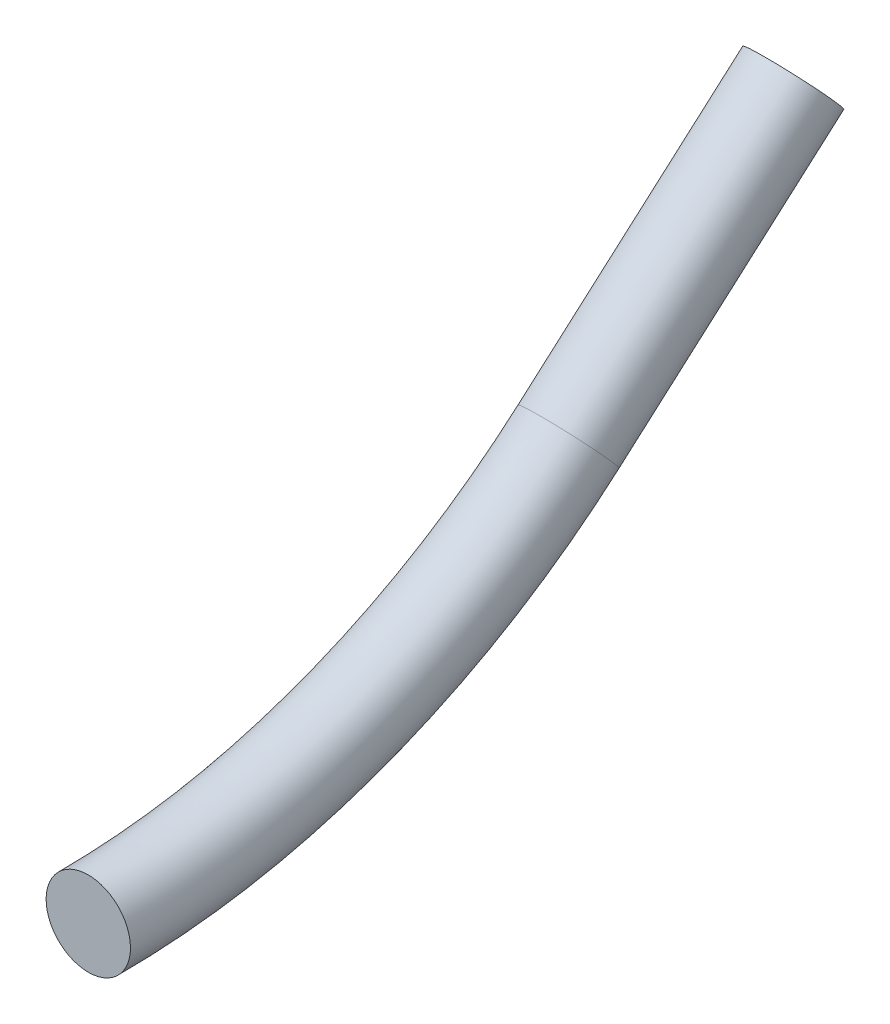
ISO-10303-21;
HEADER;
FILE_DESCRIPTION(('STEP AP214'),'2;1');
FILE_NAME('part.step','',(''),(''),'','','');
FILE_SCHEMA(('AUTOMOTIVE_DESIGN { 1 0 10303 214 1 1 1 1 }'));
ENDSEC;
DATA;
#1=APPLICATION_CONTEXT('core data for automotive mechanical design processes');
#2=APPLICATION_PROTOCOL_DEFINITION('international standard','automotive_design',2000,#1);
#3=PRODUCT_CONTEXT('',#1,'mechanical');
#4=PRODUCT('Part','Part','',(#3));
#5=PRODUCT_RELATED_PRODUCT_CATEGORY('part','',(#4));
#6=PRODUCT_DEFINITION_FORMATION('','',#4);
#7=PRODUCT_DEFINITION_CONTEXT('part definition',#1,'design');
#8=PRODUCT_DEFINITION('design','',#6,#7);
#9=PRODUCT_DEFINITION_SHAPE('','',#8);
#10=(LENGTH_UNIT() NAMED_UNIT(*) SI_UNIT(.MILLI.,.METRE.));
#11=(NAMED_UNIT(*) PLANE_ANGLE_UNIT() SI_UNIT($,.RADIAN.));
#12=(NAMED_UNIT(*) SI_UNIT($,.STERADIAN.) SOLID_ANGLE_UNIT());
#13=UNCERTAINTY_MEASURE_WITH_UNIT(LENGTH_MEASURE(1.E-05),#10,'distance_accuracy_value','');
#14=(GEOMETRIC_REPRESENTATION_CONTEXT(3) GLOBAL_UNCERTAINTY_ASSIGNED_CONTEXT((#13)) GLOBAL_UNIT_ASSIGNED_CONTEXT((#10,
#11,#12)) REPRESENTATION_CONTEXT('',''));
#15=CARTESIAN_POINT('',(0.,0.,0.));
#16=DIRECTION('',(0.,0.,1.));
#17=DIRECTION('',(1.,0.,0.));
#18=AXIS2_PLACEMENT_3D('',#15,#16,#17);
#19=CARTESIAN_POINT('',(0.,438.786528354059,1732.00940009833));
#20=DIRECTION('',(-1.,0.,0.));
#21=DIRECTION('',(0.,0.,1.));
#22=AXIS2_PLACEMENT_3D('',#19,#20,#21);
#23=TOROIDAL_SURFACE('',#22,1475.1544496116,85.725);
#24=CARTESIAN_POINT('',(-8.88178419700125E-13,-667.145720816301,755.795022794911));
#25=DIRECTION('',(0.,-0.661770960702079,0.749706072785493));
#26=DIRECTION('',(0.,-0.749706072785493,-0.661770960702079));
#27=AXIS2_PLACEMENT_3D('',#24,#25,#26);
#28=CIRCLE('',#27,85.725);
#29=CARTESIAN_POINT('',(-9.39792740525201E-13,-731.414273905836,699.064707188726));
#30=VERTEX_POINT('',#29);
#31=EDGE_CURVE('E39',#30,#30,#28,.T.);
#32=CARTESIAN_POINT('',(-8.88178419700125E-13,-1036.36792125755,1732.00940009832));
#33=DIRECTION('',(0.,0.,1.));
#34=DIRECTION('',(0.,-1.,0.));
#35=AXIS2_PLACEMENT_3D('',#32,#33,#34);
#36=CIRCLE('',#35,85.725);
#37=CARTESIAN_POINT('',(-9.39792740525199E-13,-1122.09292125754,1732.00940009832));
#38=VERTEX_POINT('',#37);
#39=EDGE_CURVE('E10',#38,#38,#36,.T.);
#40=CARTESIAN_POINT('',(0.,438.786528354059,1732.00940009833));
#41=DIRECTION('',(-1.,0.,0.));
#42=DIRECTION('',(0.,0.,1.));
#43=AXIS2_PLACEMENT_3D('',#40,#41,#42);
#44=CIRCLE('',#43,1560.8794496116);
#45=EDGE_CURVE('',#30,#38,#44,.T.);
#46=ORIENTED_EDGE('',*,*,#31,.T.);
#47=ORIENTED_EDGE('',*,*,#39,.F.);
#48=ORIENTED_EDGE('',*,*,#45,.T.);
#49=ORIENTED_EDGE('',*,*,#45,.F.);
#50=EDGE_LOOP('',(#46,#48,#47,#49));
#51=FACE_BOUND('',#50,.T.);
#52=ADVANCED_FACE('F33',(#51),#23,.T.);
#53=CARTESIAN_POINT('',(-8.88178419700125E-13,-667.145720816301,755.795022794911));
#54=DIRECTION('',(0.,0.661770960702079,-0.749706072785493));
#55=DIRECTION('',(0.,0.749706072785493,0.661770960702079));
#56=AXIS2_PLACEMENT_3D('',#53,#54,#55);
#57=CYLINDRICAL_SURFACE('',#56,85.725);
#58=ORIENTED_EDGE('',*,*,#31,.F.);
#59=EDGE_LOOP('',(#58));
#60=FACE_BOUND('',#59,.T.);
#61=CARTESIAN_POINT('',(-8.88178419700125E-13,-263.73014317231,298.774200824876));
#62=DIRECTION('',(0.,-0.661770960702079,0.749706072785493));
#63=DIRECTION('',(0.,-0.749706072785493,-0.661770960702079));
#64=AXIS2_PLACEMENT_3D('',#61,#62,#63);
#65=CIRCLE('',#64,85.725);
#66=CARTESIAN_POINT('',(-8.78661032821526E-13,-327.998696261847,242.04388521869));
#67=VERTEX_POINT('',#66);
#68=EDGE_CURVE('E43',#67,#67,#65,.T.);
#69=ORIENTED_EDGE('',*,*,#68,.T.);
#70=EDGE_LOOP('',(#69));
#71=FACE_BOUND('',#70,.T.);
#72=ADVANCED_FACE('F50',(#60,#71),#57,.T.);
#73=CARTESIAN_POINT('',(-8.88178419700125E-13,-1036.36792125755,1732.00940009832));
#74=DIRECTION('',(0.,0.,1.));
#75=DIRECTION('',(0.,-1.,0.));
#76=AXIS2_PLACEMENT_3D('',#73,#74,#75);
#77=PLANE('',#76);
#78=ORIENTED_EDGE('',*,*,#39,.T.);
#79=EDGE_LOOP('',(#78));
#80=FACE_BOUND('',#79,.T.);
#81=ADVANCED_FACE('F54',(#80),#77,.T.);
#82=CARTESIAN_POINT('',(-8.88178419700125E-13,-263.73014317231,298.774200824876));
#83=DIRECTION('',(0.,-0.661770960702079,0.749706072785493));
#84=DIRECTION('',(0.,-0.749706072785493,-0.661770960702079));
#85=AXIS2_PLACEMENT_3D('',#82,#83,#84);
#86=PLANE('',#85);
#87=ORIENTED_EDGE('',*,*,#68,.F.);
#88=EDGE_LOOP('',(#87));
#89=FACE_BOUND('',#88,.T.);
#90=ADVANCED_FACE('F52',(#89),#86,.F.);
#91=CLOSED_SHELL('',(#52,#72,#81,#90));
#92=MANIFOLD_SOLID_BREP('B2',#91);
#93=ADVANCED_BREP_SHAPE_REPRESENTATION('',(#18,#92),#14);
#94=SHAPE_DEFINITION_REPRESENTATION(#9,#93);
ENDSEC;
END-ISO-10303-21;
